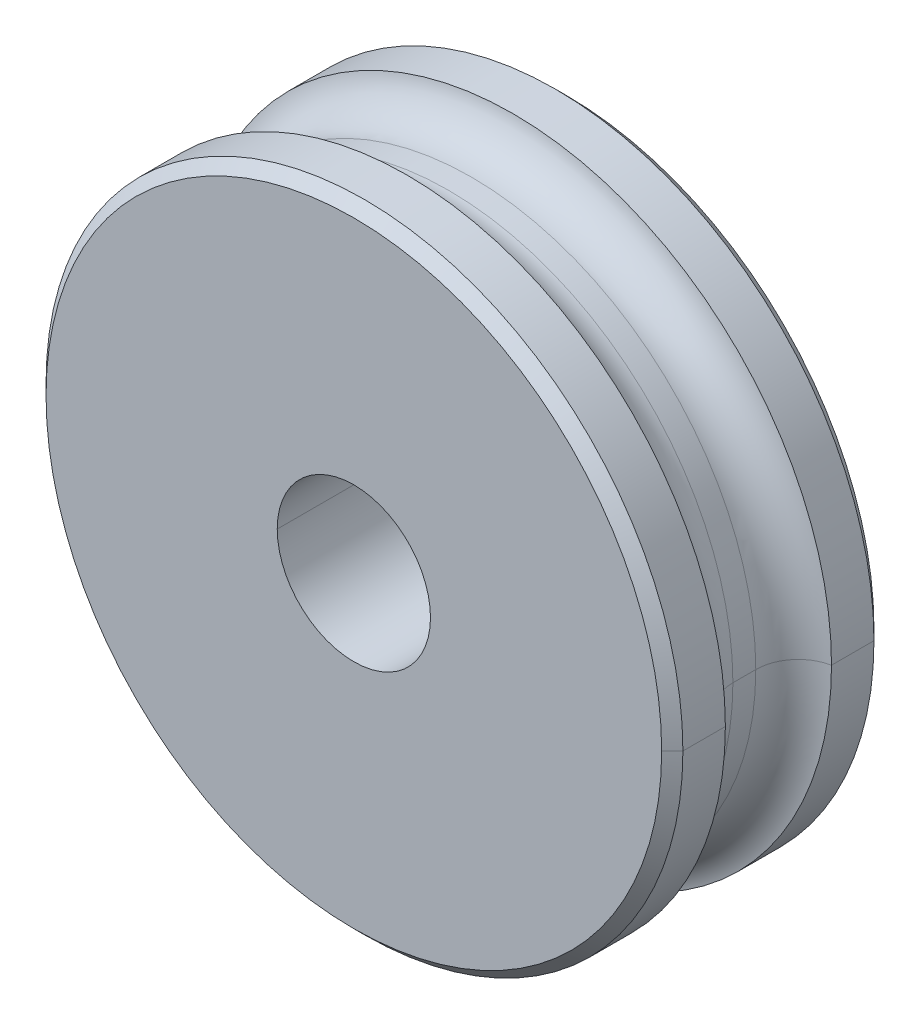
ISO-10303-21;
HEADER;
FILE_DESCRIPTION(('STEP AP214'),'2;1');
FILE_NAME('part.step','',(''),(''),'','','');
FILE_SCHEMA(('AUTOMOTIVE_DESIGN { 1 0 10303 214 1 1 1 1 }'));
ENDSEC;
DATA;
#1=APPLICATION_CONTEXT('core data for automotive mechanical design processes');
#2=APPLICATION_PROTOCOL_DEFINITION('international standard','automotive_design',2000,#1);
#3=PRODUCT_CONTEXT('',#1,'mechanical');
#4=PRODUCT('Part','Part','',(#3));
#5=PRODUCT_RELATED_PRODUCT_CATEGORY('part','',(#4));
#6=PRODUCT_DEFINITION_FORMATION('','',#4);
#7=PRODUCT_DEFINITION_CONTEXT('part definition',#1,'design');
#8=PRODUCT_DEFINITION('design','',#6,#7);
#9=PRODUCT_DEFINITION_SHAPE('','',#8);
#10=(LENGTH_UNIT() NAMED_UNIT(*) SI_UNIT(.MILLI.,.METRE.));
#11=(NAMED_UNIT(*) PLANE_ANGLE_UNIT() SI_UNIT($,.RADIAN.));
#12=(NAMED_UNIT(*) SI_UNIT($,.STERADIAN.) SOLID_ANGLE_UNIT());
#13=UNCERTAINTY_MEASURE_WITH_UNIT(LENGTH_MEASURE(1.E-05),#10,'distance_accuracy_value','');
#14=(GEOMETRIC_REPRESENTATION_CONTEXT(3) GLOBAL_UNCERTAINTY_ASSIGNED_CONTEXT((#13)) GLOBAL_UNIT_ASSIGNED_CONTEXT((#10,
#11,#12)) REPRESENTATION_CONTEXT('',''));
#15=CARTESIAN_POINT('',(0.,0.,0.));
#16=DIRECTION('',(0.,0.,1.));
#17=DIRECTION('',(1.,0.,0.));
#18=AXIS2_PLACEMENT_3D('',#15,#16,#17);
#19=CARTESIAN_POINT('',(2940.99999999999,825.000000000002,2.15668992822104));
#20=DIRECTION('',(0.,0.,0.999999999999998));
#21=DIRECTION('',(-0.999999998448021,-5.57131811639791E-05,0.));
#22=AXIS2_PLACEMENT_3D('',#19,#20,#21);
#23=TOROIDAL_SURFACE('',#22,61.5755913086727,8.);
#24=CARTESIAN_POINT('',(2940.99999999999,825.000000000002,2.15668998169072));
#25=DIRECTION('',(0.,0.,0.999999999999998));
#26=DIRECTION('',(1.,0.,0.));
#27=AXIS2_PLACEMENT_3D('',#24,#25,#26);
#28=CIRCLE('',#27,53.575591308672);
#29=CARTESIAN_POINT('',(2887.42440869132,825.000000000005,2.15668996832319));
#30=VERTEX_POINT('',#29);
#31=CARTESIAN_POINT('',(2994.57559130867,825.000000000004,2.15668996832363));
#32=VERTEX_POINT('',#31);
#33=EDGE_CURVE('E166',#30,#32,#28,.F.);
#34=ORIENTED_EDGE('',*,*,#33,.F.);
#35=CARTESIAN_POINT('',(2879.42440869132,825.000000000001,2.15668992822149));
#36=DIRECTION('',(0.,-1.,0.));
#37=DIRECTION('',(-1.,0.,0.));
#38=AXIS2_PLACEMENT_3D('',#35,#36,#37);
#39=CIRCLE('',#38,8.);
#40=CARTESIAN_POINT('',(2880.99999999737,825.000000000001,9.99999998691736));
#41=VERTEX_POINT('',#40);
#42=EDGE_CURVE('E114',#30,#41,#39,.T.);
#43=ORIENTED_EDGE('',*,*,#42,.T.);
#44=CARTESIAN_POINT('',(2940.99999999999,825.000000000002,10.0000000000002));
#45=DIRECTION('',(0.,0.,0.999999999999998));
#46=DIRECTION('',(1.,0.,0.));
#47=AXIS2_PLACEMENT_3D('',#44,#45,#46);
#48=CIRCLE('',#47,60.);
#49=CARTESIAN_POINT('',(3001.00000000262,825.000000000002,9.99999998691736));
#50=VERTEX_POINT('',#49);
#51=EDGE_CURVE('E127',#50,#41,#48,.T.);
#52=ORIENTED_EDGE('',*,*,#51,.F.);
#53=CARTESIAN_POINT('',(3002.57559130867,825.000000000003,2.15668992822149));
#54=DIRECTION('',(0.,1.,0.));
#55=DIRECTION('',(1.,0.,0.));
#56=AXIS2_PLACEMENT_3D('',#53,#54,#55);
#57=CIRCLE('',#56,8.);
#58=EDGE_CURVE('E102',#50,#32,#57,.F.);
#59=ORIENTED_EDGE('',*,*,#58,.T.);
#60=EDGE_LOOP('',(#34,#43,#52,#59));
#61=FACE_BOUND('',#60,.T.);
#62=ADVANCED_FACE('F16',(#61),#23,.F.);
#63=CARTESIAN_POINT('',(2940.99999999999,825.000000000002,2.15668992822149));
#64=DIRECTION('',(0.,0.,0.999999999999998));
#65=DIRECTION('',(0.999999998448021,5.57131811603718E-05,0.));
#66=AXIS2_PLACEMENT_3D('',#63,#64,#65);
#67=TOROIDAL_SURFACE('',#66,61.575591308674,8.);
#68=CARTESIAN_POINT('',(2940.99999999999,825.000000000002,2.15668998169072));
#69=DIRECTION('',(0.,0.,0.999999999999998));
#70=DIRECTION('',(1.,0.,0.));
#71=AXIS2_PLACEMENT_3D('',#68,#69,#70);
#72=CIRCLE('',#71,53.575591308672);
#73=EDGE_CURVE('E107',#32,#30,#72,.F.);
#74=ORIENTED_EDGE('',*,*,#73,.F.);
#75=ORIENTED_EDGE('',*,*,#58,.F.);
#76=CARTESIAN_POINT('',(2940.99999999999,825.000000000002,10.0000000000002));
#77=DIRECTION('',(0.,0.,0.999999999999998));
#78=DIRECTION('',(1.,0.,0.));
#79=AXIS2_PLACEMENT_3D('',#76,#77,#78);
#80=CIRCLE('',#79,60.);
#81=EDGE_CURVE('E105',#41,#50,#80,.T.);
#82=ORIENTED_EDGE('',*,*,#81,.F.);
#83=ORIENTED_EDGE('',*,*,#42,.F.);
#84=EDGE_LOOP('',(#74,#75,#82,#83));
#85=FACE_BOUND('',#84,.T.);
#86=ADVANCED_FACE('F104',(#85),#67,.F.);
#87=CARTESIAN_POINT('',(2940.99999999999,825.000000000002,10.0000000000002));
#88=DIRECTION('',(0.,0.,0.999999999999998));
#89=DIRECTION('',(1.,0.,0.));
#90=AXIS2_PLACEMENT_3D('',#87,#88,#89);
#91=CYLINDRICAL_SURFACE('',#90,53.575591308672);
#92=DIRECTION('',(0.,0.,0.999999999999998));
#93=VECTOR('',#92,1.);
#94=CARTESIAN_POINT('',(2887.42440869132,825.000000000005,9.99999999999979));
#95=LINE('',#94,#93);
#96=CARTESIAN_POINT('',(2887.42440869132,825.000000000003,-2.15668994103924));
#97=VERTEX_POINT('',#96);
#98=EDGE_CURVE('E162',#97,#30,#95,.T.);
#99=ORIENTED_EDGE('',*,*,#98,.F.);
#100=CARTESIAN_POINT('',(2940.99999999999,825.000000000002,-2.15668992748874));
#101=DIRECTION('',(0.,0.,0.999999999999998));
#102=DIRECTION('',(-0.99999999840531,5.64746452723641E-05,0.));
#103=AXIS2_PLACEMENT_3D('',#100,#101,#102);
#104=CIRCLE('',#103,53.5755913086718);
#105=CARTESIAN_POINT('',(2994.57559130867,825.000000000004,-2.15668992748874));
#106=VERTEX_POINT('',#105);
#107=EDGE_CURVE('E136',#97,#106,#104,.T.);
#108=ORIENTED_EDGE('',*,*,#107,.T.);
#109=DIRECTION('',(0.,0.,0.999999999999998));
#110=VECTOR('',#109,1.);
#111=CARTESIAN_POINT('',(2994.57559130867,825.000000000004,10.0000000000002));
#112=LINE('',#111,#110);
#113=EDGE_CURVE('E130',#32,#106,#112,.F.);
#114=ORIENTED_EDGE('',*,*,#113,.F.);
#115=ORIENTED_EDGE('',*,*,#73,.T.);
#116=EDGE_LOOP('',(#99,#108,#114,#115));
#117=FACE_BOUND('',#116,.T.);
#118=ADVANCED_FACE('F181',(#117),#91,.T.);
#119=CARTESIAN_POINT('',(2940.99999999999,825.000000000002,10.0000000000002));
#120=DIRECTION('',(0.,0.,0.999999999999998));
#121=DIRECTION('',(1.,0.,0.));
#122=AXIS2_PLACEMENT_3D('',#119,#120,#121);
#123=CYLINDRICAL_SURFACE('',#122,53.575591308672);
#124=ORIENTED_EDGE('',*,*,#113,.T.);
#125=CARTESIAN_POINT('',(2940.99999999999,825.000000000002,-2.15668992748919));
#126=DIRECTION('',(0.,0.,0.999999999999998));
#127=DIRECTION('',(0.99999999840531,-5.64746452701992E-05,0.));
#128=AXIS2_PLACEMENT_3D('',#125,#126,#127);
#129=CIRCLE('',#128,53.5755913086718);
#130=EDGE_CURVE('E155',#106,#97,#129,.T.);
#131=ORIENTED_EDGE('',*,*,#130,.T.);
#132=ORIENTED_EDGE('',*,*,#98,.T.);
#133=ORIENTED_EDGE('',*,*,#33,.T.);
#134=EDGE_LOOP('',(#124,#131,#132,#133));
#135=FACE_BOUND('',#134,.T.);
#136=ADVANCED_FACE('F184',(#135),#123,.T.);
#137=CARTESIAN_POINT('',(2940.99999999999,825.000000000001,-20.));
#138=DIRECTION('',(0.,0.,0.999999999999998));
#139=DIRECTION('',(1.,0.,0.));
#140=AXIS2_PLACEMENT_3D('',#137,#138,#139);
#141=CYLINDRICAL_SURFACE('',#140,60.);
#142=DIRECTION('',(0.,0.,0.999999999999998));
#143=VECTOR('',#142,1.);
#144=CARTESIAN_POINT('',(2880.99999999999,825.000000000003,-20.));
#145=LINE('',#144,#143);
#146=CARTESIAN_POINT('',(2881.00000000017,825.000000014626,18.000000000221));
#147=VERTEX_POINT('',#146);
#148=EDGE_CURVE('E123',#147,#41,#145,.F.);
#149=ORIENTED_EDGE('',*,*,#148,.F.);
#150=CARTESIAN_POINT('',(2940.99999999999,825.000000000002,18.0000000001996));
#151=DIRECTION('',(0.,0.,-0.999999999999998));
#152=DIRECTION('',(0.,-1.,0.));
#153=AXIS2_PLACEMENT_3D('',#150,#151,#152);
#154=CIRCLE('',#153,59.9999999997863);
#155=CARTESIAN_POINT('',(3000.99999999981,825.000000081151,18.0000000001641));
#156=VERTEX_POINT('',#155);
#157=EDGE_CURVE('E134',#156,#147,#154,.F.);
#158=ORIENTED_EDGE('',*,*,#157,.F.);
#159=DIRECTION('',(0.,0.,0.999999999999998));
#160=VECTOR('',#159,1.);
#161=CARTESIAN_POINT('',(3001.,825.000000000003,-20.));
#162=LINE('',#161,#160);
#163=EDGE_CURVE('E121',#50,#156,#162,.T.);
#164=ORIENTED_EDGE('',*,*,#163,.F.);
#165=ORIENTED_EDGE('',*,*,#51,.T.);
#166=EDGE_LOOP('',(#149,#158,#164,#165));
#167=FACE_BOUND('',#166,.T.);
#168=ADVANCED_FACE('F133',(#167),#141,.T.);
#169=CARTESIAN_POINT('',(2940.99999999999,825.000000000001,-20.));
#170=DIRECTION('',(0.,0.,0.999999999999998));
#171=DIRECTION('',(1.,0.,0.));
#172=AXIS2_PLACEMENT_3D('',#169,#170,#171);
#173=CYLINDRICAL_SURFACE('',#172,60.);
#174=ORIENTED_EDGE('',*,*,#163,.T.);
#175=CARTESIAN_POINT('',(2940.99999999999,825.000000000002,18.0000000001996));
#176=DIRECTION('',(0.,0.,-0.999999999999998));
#177=DIRECTION('',(0.,-1.,0.));
#178=AXIS2_PLACEMENT_3D('',#175,#176,#177);
#179=CIRCLE('',#178,59.9999999997863);
#180=EDGE_CURVE('E210',#147,#156,#179,.F.);
#181=ORIENTED_EDGE('',*,*,#180,.F.);
#182=ORIENTED_EDGE('',*,*,#148,.T.);
#183=ORIENTED_EDGE('',*,*,#81,.T.);
#184=EDGE_LOOP('',(#174,#181,#182,#183));
#185=FACE_BOUND('',#184,.T.);
#186=ADVANCED_FACE('F118',(#185),#173,.T.);
#187=CARTESIAN_POINT('',(2940.99999999999,825.000000000002,-2.15668992748919));
#188=DIRECTION('',(0.,0.,0.999999999999998));
#189=DIRECTION('',(-0.999999998405307,5.64746452986825E-05,0.));
#190=AXIS2_PLACEMENT_3D('',#187,#188,#189);
#191=TOROIDAL_SURFACE('',#190,61.575591308672,8.);
#192=ORIENTED_EDGE('',*,*,#107,.F.);
#193=CARTESIAN_POINT('',(2879.42440869132,825.000000000002,-2.15668992748919));
#194=DIRECTION('',(0.,-1.,0.));
#195=DIRECTION('',(-1.,0.,0.));
#196=AXIS2_PLACEMENT_3D('',#193,#194,#195);
#197=CIRCLE('',#196,8.);
#198=CARTESIAN_POINT('',(2880.99999999733,825.000000000001,-9.99999998674106));
#199=VERTEX_POINT('',#198);
#200=EDGE_CURVE('E159',#97,#199,#197,.F.);
#201=ORIENTED_EDGE('',*,*,#200,.T.);
#202=CARTESIAN_POINT('',(2940.99999999999,825.000000000002,-9.99999999999979));
#203=DIRECTION('',(0.,0.,0.999999999999998));
#204=DIRECTION('',(1.,0.,0.));
#205=AXIS2_PLACEMENT_3D('',#202,#203,#204);
#206=CIRCLE('',#205,60.);
#207=CARTESIAN_POINT('',(3001.00000000266,825.000000000001,-9.99999998674106));
#208=VERTEX_POINT('',#207);
#209=EDGE_CURVE('E216',#208,#199,#206,.F.);
#210=ORIENTED_EDGE('',*,*,#209,.F.);
#211=CARTESIAN_POINT('',(3002.57559130867,825.000000000003,-2.15668992748874));
#212=DIRECTION('',(0.,1.,0.));
#213=DIRECTION('',(1.,0.,0.));
#214=AXIS2_PLACEMENT_3D('',#211,#212,#213);
#215=CIRCLE('',#214,8.);
#216=EDGE_CURVE('E71',#208,#106,#215,.T.);
#217=ORIENTED_EDGE('',*,*,#216,.T.);
#218=EDGE_LOOP('',(#192,#201,#210,#217));
#219=FACE_BOUND('',#218,.T.);
#220=ADVANCED_FACE('F193',(#219),#191,.F.);
#221=CARTESIAN_POINT('',(2940.99999999999,825.000000000002,-2.15668992748874));
#222=DIRECTION('',(0.,0.,0.999999999999998));
#223=DIRECTION('',(0.999999998405307,-5.6474645271636E-05,0.));
#224=AXIS2_PLACEMENT_3D('',#221,#222,#223);
#225=TOROIDAL_SURFACE('',#224,61.5755913086733,8.);
#226=ORIENTED_EDGE('',*,*,#130,.F.);
#227=ORIENTED_EDGE('',*,*,#216,.F.);
#228=CARTESIAN_POINT('',(2940.99999999999,825.000000000002,-9.99999999999979));
#229=DIRECTION('',(0.,0.,0.999999999999998));
#230=DIRECTION('',(1.,0.,0.));
#231=AXIS2_PLACEMENT_3D('',#228,#229,#230);
#232=CIRCLE('',#231,60.);
#233=EDGE_CURVE('E231',#199,#208,#232,.F.);
#234=ORIENTED_EDGE('',*,*,#233,.F.);
#235=ORIENTED_EDGE('',*,*,#200,.F.);
#236=EDGE_LOOP('',(#226,#227,#234,#235));
#237=FACE_BOUND('',#236,.T.);
#238=ADVANCED_FACE('F197',(#237),#225,.F.);
#239=CARTESIAN_POINT('',(2940.99999999999,825.000000000002,18.0000000002565));
#240=DIRECTION('',(0.,0.,-0.999999999999998));
#241=DIRECTION('',(-1.,0.,0.));
#242=AXIS2_PLACEMENT_3D('',#239,#240,#241);
#243=CONICAL_SURFACE('',#242,59.9999999997295,0.785398163397448);
#244=DIRECTION('',(0.707106781186549,-9.82240733193862E-10,0.707106781186545));
#245=VECTOR('',#244,1.);
#246=CARTESIAN_POINT('',(-496137.000000002,825.000693267959,-498999.999999999));
#247=LINE('',#246,#245);
#248=CARTESIAN_POINT('',(2883.00000000039,824.999999987993,20.0000000003797));
#249=VERTEX_POINT('',#248);
#250=EDGE_CURVE('E208',#249,#147,#247,.F.);
#251=ORIENTED_EDGE('',*,*,#250,.F.);
#252=CARTESIAN_POINT('',(2940.99999999999,825.000000000002,20.0000000003797));
#253=DIRECTION('',(0.,0.,-0.999999999999998));
#254=DIRECTION('',(-1.,0.,0.));
#255=AXIS2_PLACEMENT_3D('',#252,#253,#254);
#256=CIRCLE('',#255,57.9999999996063);
#257=CARTESIAN_POINT('',(2998.9999999996,825.000000104594,20.0000000003797));
#258=VERTEX_POINT('',#257);
#259=EDGE_CURVE('E20',#258,#249,#256,.F.);
#260=ORIENTED_EDGE('',*,*,#259,.F.);
#261=DIRECTION('',(-0.70710678118655,-1.27511945446912E-09,0.707106781186546));
#262=VECTOR('',#261,1.);
#263=CARTESIAN_POINT('',(502019.000000002,825.000899982689,-498999.999999999));
#264=LINE('',#263,#262);
#265=EDGE_CURVE('E60',#156,#258,#264,.T.);
#266=ORIENTED_EDGE('',*,*,#265,.F.);
#267=ORIENTED_EDGE('',*,*,#157,.T.);
#268=EDGE_LOOP('',(#251,#260,#266,#267));
#269=FACE_BOUND('',#268,.T.);
#270=ADVANCED_FACE('F322',(#269),#243,.T.);
#271=CARTESIAN_POINT('',(2940.99999999999,825.000000000002,18.0000000002565));
#272=DIRECTION('',(0.,0.,-0.999999999999998));
#273=DIRECTION('',(-1.,0.,0.));
#274=AXIS2_PLACEMENT_3D('',#271,#272,#273);
#275=CONICAL_SURFACE('',#274,59.9999999997295,0.785398163397448);
#276=ORIENTED_EDGE('',*,*,#265,.T.);
#277=CARTESIAN_POINT('',(2940.99999999999,825.000000000002,20.0000000003797));
#278=DIRECTION('',(0.,0.,-0.999999999999998));
#279=DIRECTION('',(-1.,0.,0.));
#280=AXIS2_PLACEMENT_3D('',#277,#278,#279);
#281=CIRCLE('',#280,57.9999999996063);
#282=EDGE_CURVE('E280',#249,#258,#281,.F.);
#283=ORIENTED_EDGE('',*,*,#282,.F.);
#284=ORIENTED_EDGE('',*,*,#250,.T.);
#285=ORIENTED_EDGE('',*,*,#180,.T.);
#286=EDGE_LOOP('',(#276,#283,#284,#285));
#287=FACE_BOUND('',#286,.T.);
#288=ADVANCED_FACE('F323',(#287),#275,.T.);
#289=CARTESIAN_POINT('',(2940.99999999999,825.000000000001,-20.));
#290=DIRECTION('',(0.,0.,0.999999999999998));
#291=DIRECTION('',(1.,0.,0.));
#292=AXIS2_PLACEMENT_3D('',#289,#290,#291);
#293=CYLINDRICAL_SURFACE('',#292,60.);
#294=DIRECTION('',(0.,0.,0.999999999999998));
#295=VECTOR('',#294,1.);
#296=CARTESIAN_POINT('',(2880.99999999999,825.000000000003,-20.));
#297=LINE('',#296,#295);
#298=CARTESIAN_POINT('',(2881.00000000034,824.999999966741,-18.0000000004483));
#299=VERTEX_POINT('',#298);
#300=EDGE_CURVE('E228',#299,#199,#297,.T.);
#301=ORIENTED_EDGE('',*,*,#300,.F.);
#302=CARTESIAN_POINT('',(2940.99999999999,825.000000000002,-18.000000000427));
#303=DIRECTION('',(0.,0.,0.999999999999998));
#304=DIRECTION('',(0.,-1.,0.));
#305=AXIS2_PLACEMENT_3D('',#302,#303,#304);
#306=CIRCLE('',#305,59.999999999559);
#307=CARTESIAN_POINT('',(3000.99999999964,824.999999937493,-18.0000000003342));
#308=VERTEX_POINT('',#307);
#309=EDGE_CURVE('E276',#308,#299,#306,.F.);
#310=ORIENTED_EDGE('',*,*,#309,.F.);
#311=DIRECTION('',(0.,0.,0.999999999999998));
#312=VECTOR('',#311,1.);
#313=CARTESIAN_POINT('',(3001.,825.000000000003,-20.));
#314=LINE('',#313,#312);
#315=EDGE_CURVE('E234',#208,#308,#314,.F.);
#316=ORIENTED_EDGE('',*,*,#315,.F.);
#317=ORIENTED_EDGE('',*,*,#209,.T.);
#318=EDGE_LOOP('',(#301,#310,#316,#317));
#319=FACE_BOUND('',#318,.T.);
#320=ADVANCED_FACE('F325',(#319),#293,.T.);
#321=CARTESIAN_POINT('',(2940.99999999999,825.000000000001,-20.));
#322=DIRECTION('',(0.,0.,0.999999999999998));
#323=DIRECTION('',(1.,0.,0.));
#324=AXIS2_PLACEMENT_3D('',#321,#322,#323);
#325=CYLINDRICAL_SURFACE('',#324,60.);
#326=ORIENTED_EDGE('',*,*,#315,.T.);
#327=CARTESIAN_POINT('',(2940.99999999999,825.000000000002,-18.000000000427));
#328=DIRECTION('',(0.,0.,0.999999999999998));
#329=DIRECTION('',(0.,-1.,0.));
#330=AXIS2_PLACEMENT_3D('',#327,#328,#329);
#331=CIRCLE('',#330,59.999999999559);
#332=EDGE_CURVE('E255',#299,#308,#331,.F.);
#333=ORIENTED_EDGE('',*,*,#332,.F.);
#334=ORIENTED_EDGE('',*,*,#300,.T.);
#335=ORIENTED_EDGE('',*,*,#233,.T.);
#336=EDGE_LOOP('',(#326,#333,#334,#335));
#337=FACE_BOUND('',#336,.T.);
#338=ADVANCED_FACE('F251',(#337),#325,.T.);
#339=CARTESIAN_POINT('',(0.,0.,20.));
#340=DIRECTION('',(0.,0.,0.999999999999998));
#341=DIRECTION('',(1.,0.,0.));
#342=AXIS2_PLACEMENT_3D('',#339,#340,#341);
#343=PLANE('',#342);
#344=CARTESIAN_POINT('',(2940.99999999999,825.000000000002,20.));
#345=DIRECTION('',(0.,0.,0.999999999999998));
#346=DIRECTION('',(1.,0.,0.));
#347=AXIS2_PLACEMENT_3D('',#344,#345,#346);
#348=CIRCLE('',#347,14.4381275614838);
#349=CARTESIAN_POINT('',(2955.43812756148,825.000000000001,20.));
#350=VERTEX_POINT('',#349);
#351=CARTESIAN_POINT('',(2926.56187243851,825.000000000001,20.));
#352=VERTEX_POINT('',#351);
#353=EDGE_CURVE('E293',#350,#352,#348,.F.);
#354=ORIENTED_EDGE('',*,*,#353,.T.);
#355=CARTESIAN_POINT('',(2940.99999999999,825.000000000002,20.));
#356=DIRECTION('',(0.,0.,0.999999999999998));
#357=DIRECTION('',(1.,0.,0.));
#358=AXIS2_PLACEMENT_3D('',#355,#356,#357);
#359=CIRCLE('',#358,14.4381275614838);
#360=EDGE_CURVE('E290',#352,#350,#359,.F.);
#361=ORIENTED_EDGE('',*,*,#360,.T.);
#362=EDGE_LOOP('',(#354,#361));
#363=FACE_BOUND('',#362,.T.);
#364=ORIENTED_EDGE('',*,*,#259,.T.);
#365=ORIENTED_EDGE('',*,*,#282,.T.);
#366=EDGE_LOOP('',(#364,#365));
#367=FACE_BOUND('',#366,.T.);
#368=ADVANCED_FACE('F320',(#363,#367),#343,.T.);
#369=CARTESIAN_POINT('',(2940.99999999999,825.000000000002,-18.0000000004839));
#370=DIRECTION('',(0.,0.,0.999999999999998));
#371=DIRECTION('',(1.,0.,0.));
#372=AXIS2_PLACEMENT_3D('',#369,#370,#371);
#373=CONICAL_SURFACE('',#372,59.9999999995021,0.785398163397448);
#374=DIRECTION('',(0.70710678118655,1.27511795566804E-09,-0.707106781186546));
#375=VECTOR('',#374,1.);
#376=CARTESIAN_POINT('',(-496137.000000001,824.999100018323,498999.999999999));
#377=LINE('',#376,#375);
#378=CARTESIAN_POINT('',(2883.00000000022,824.999999987991,-20.0000000002092));
#379=VERTEX_POINT('',#378);
#380=EDGE_CURVE('E273',#379,#299,#377,.F.);
#381=ORIENTED_EDGE('',*,*,#380,.F.);
#382=CARTESIAN_POINT('',(2940.99999999999,825.000000000002,-20.0000000002092));
#383=DIRECTION('',(0.,0.,0.999999999999998));
#384=DIRECTION('',(1.,0.,0.));
#385=AXIS2_PLACEMENT_3D('',#382,#383,#384);
#386=CIRCLE('',#385,57.9999999997768);
#387=CARTESIAN_POINT('',(2998.99999999977,824.999999919435,-20.0000000002092));
#388=VERTEX_POINT('',#387);
#389=EDGE_CURVE('E297',#379,#388,#386,.T.);
#390=ORIENTED_EDGE('',*,*,#389,.T.);
#391=DIRECTION('',(-0.707106781186549,9.82240844216165E-10,-0.707106781186545));
#392=VECTOR('',#391,1.);
#393=CARTESIAN_POINT('',(502019.000000001,824.999306731917,498999.999999999));
#394=LINE('',#393,#392);
#395=EDGE_CURVE('E272',#308,#388,#394,.T.);
#396=ORIENTED_EDGE('',*,*,#395,.F.);
#397=ORIENTED_EDGE('',*,*,#309,.T.);
#398=EDGE_LOOP('',(#381,#390,#396,#397));
#399=FACE_BOUND('',#398,.T.);
#400=ADVANCED_FACE('F350',(#399),#373,.T.);
#401=CARTESIAN_POINT('',(2940.99999999999,825.000000000002,-18.0000000004839));
#402=DIRECTION('',(0.,0.,0.999999999999998));
#403=DIRECTION('',(1.,0.,0.));
#404=AXIS2_PLACEMENT_3D('',#401,#402,#403);
#405=CONICAL_SURFACE('',#404,59.9999999995021,0.785398163397448);
#406=ORIENTED_EDGE('',*,*,#395,.T.);
#407=CARTESIAN_POINT('',(2940.99999999999,825.000000000002,-20.0000000002092));
#408=DIRECTION('',(0.,0.,0.999999999999998));
#409=DIRECTION('',(1.,0.,0.));
#410=AXIS2_PLACEMENT_3D('',#407,#408,#409);
#411=CIRCLE('',#410,57.9999999997768);
#412=EDGE_CURVE('E305',#388,#379,#411,.T.);
#413=ORIENTED_EDGE('',*,*,#412,.T.);
#414=ORIENTED_EDGE('',*,*,#380,.T.);
#415=ORIENTED_EDGE('',*,*,#332,.T.);
#416=EDGE_LOOP('',(#406,#413,#414,#415));
#417=FACE_BOUND('',#416,.T.);
#418=ADVANCED_FACE('F347',(#417),#405,.T.);
#419=CARTESIAN_POINT('',(2940.99999999999,825.000000000002,20.));
#420=DIRECTION('',(0.,0.,0.999999999999998));
#421=DIRECTION('',(1.,0.,0.));
#422=AXIS2_PLACEMENT_3D('',#419,#420,#421);
#423=CYLINDRICAL_SURFACE('',#422,14.4381275614838);
#424=ORIENTED_EDGE('',*,*,#360,.F.);
#425=DIRECTION('',(0.,0.,0.999999999999998));
#426=VECTOR('',#425,1.);
#427=CARTESIAN_POINT('',(2926.56187243851,825.000000000001,20.));
#428=LINE('',#427,#426);
#429=CARTESIAN_POINT('',(2926.56187243851,825.000000000001,-20.));
#430=VERTEX_POINT('',#429);
#431=EDGE_CURVE('E294',#352,#430,#428,.F.);
#432=ORIENTED_EDGE('',*,*,#431,.T.);
#433=CARTESIAN_POINT('',(2940.99999999999,825.000000000001,-20.));
#434=DIRECTION('',(0.,0.,0.999999999999998));
#435=DIRECTION('',(1.,0.,0.));
#436=AXIS2_PLACEMENT_3D('',#433,#434,#435);
#437=CIRCLE('',#436,14.4381275614838);
#438=CARTESIAN_POINT('',(2955.43812756148,825.000000000001,-20.));
#439=VERTEX_POINT('',#438);
#440=EDGE_CURVE('E27',#430,#439,#437,.F.);
#441=ORIENTED_EDGE('',*,*,#440,.T.);
#442=DIRECTION('',(0.,0.,0.999999999999998));
#443=VECTOR('',#442,1.);
#444=CARTESIAN_POINT('',(2955.43812756148,825.000000000001,20.));
#445=LINE('',#444,#443);
#446=EDGE_CURVE('E35',#439,#350,#445,.T.);
#447=ORIENTED_EDGE('',*,*,#446,.T.);
#448=EDGE_LOOP('',(#424,#432,#441,#447));
#449=FACE_BOUND('',#448,.T.);
#450=ADVANCED_FACE('F341',(#449),#423,.F.);
#451=CARTESIAN_POINT('',(2940.99999999999,825.000000000002,20.));
#452=DIRECTION('',(0.,0.,0.999999999999998));
#453=DIRECTION('',(1.,0.,0.));
#454=AXIS2_PLACEMENT_3D('',#451,#452,#453);
#455=CYLINDRICAL_SURFACE('',#454,14.4381275614838);
#456=ORIENTED_EDGE('',*,*,#353,.F.);
#457=ORIENTED_EDGE('',*,*,#446,.F.);
#458=CARTESIAN_POINT('',(2940.99999999999,825.000000000001,-20.));
#459=DIRECTION('',(0.,0.,0.999999999999998));
#460=DIRECTION('',(1.,0.,0.));
#461=AXIS2_PLACEMENT_3D('',#458,#459,#460);
#462=CIRCLE('',#461,14.4381275614838);
#463=EDGE_CURVE('E11',#439,#430,#462,.F.);
#464=ORIENTED_EDGE('',*,*,#463,.T.);
#465=ORIENTED_EDGE('',*,*,#431,.F.);
#466=EDGE_LOOP('',(#456,#457,#464,#465));
#467=FACE_BOUND('',#466,.T.);
#468=ADVANCED_FACE('F335',(#467),#455,.F.);
#469=CARTESIAN_POINT('',(0.,0.,-20.));
#470=DIRECTION('',(0.,0.,0.999999999999998));
#471=DIRECTION('',(1.,0.,0.));
#472=AXIS2_PLACEMENT_3D('',#469,#470,#471);
#473=PLANE('',#472);
#474=ORIENTED_EDGE('',*,*,#440,.F.);
#475=ORIENTED_EDGE('',*,*,#463,.F.);
#476=EDGE_LOOP('',(#474,#475));
#477=FACE_BOUND('',#476,.T.);
#478=ORIENTED_EDGE('',*,*,#389,.F.);
#479=ORIENTED_EDGE('',*,*,#412,.F.);
#480=EDGE_LOOP('',(#478,#479));
#481=FACE_BOUND('',#480,.T.);
#482=ADVANCED_FACE('F333',(#477,#481),#473,.F.);
#483=CLOSED_SHELL('',(#62,#86,#118,#136,#168,#186,#220,#238,#270,#288,#320,#338,#368,#400,#418,
#450,#468,#482));
#484=MANIFOLD_SOLID_BREP('B1',#483);
#485=ADVANCED_BREP_SHAPE_REPRESENTATION('',(#18,#484),#14);
#486=SHAPE_DEFINITION_REPRESENTATION(#9,#485);
ENDSEC;
END-ISO-10303-21;
